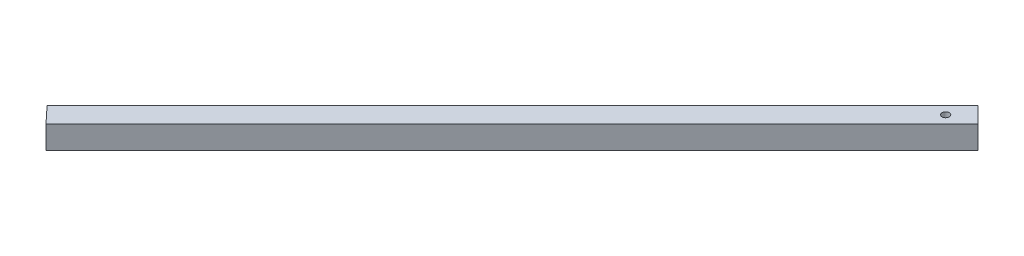
ISO-10303-21;
HEADER;
FILE_DESCRIPTION(('STEP AP214'),'2;1');
FILE_NAME('part.step','',(''),(''),'','','');
FILE_SCHEMA(('AUTOMOTIVE_DESIGN { 1 0 10303 214 1 1 1 1 }'));
ENDSEC;
DATA;
#1=APPLICATION_CONTEXT('core data for automotive mechanical design processes');
#2=APPLICATION_PROTOCOL_DEFINITION('international standard','automotive_design',2000,#1);
#3=PRODUCT_CONTEXT('',#1,'mechanical');
#4=PRODUCT('Part','Part','',(#3));
#5=PRODUCT_RELATED_PRODUCT_CATEGORY('part','',(#4));
#6=PRODUCT_DEFINITION_FORMATION('','',#4);
#7=PRODUCT_DEFINITION_CONTEXT('part definition',#1,'design');
#8=PRODUCT_DEFINITION('design','',#6,#7);
#9=PRODUCT_DEFINITION_SHAPE('','',#8);
#10=(LENGTH_UNIT() NAMED_UNIT(*) SI_UNIT(.MILLI.,.METRE.));
#11=(NAMED_UNIT(*) PLANE_ANGLE_UNIT() SI_UNIT($,.RADIAN.));
#12=(NAMED_UNIT(*) SI_UNIT($,.STERADIAN.) SOLID_ANGLE_UNIT());
#13=UNCERTAINTY_MEASURE_WITH_UNIT(LENGTH_MEASURE(1.E-05),#10,'distance_accuracy_value','');
#14=(GEOMETRIC_REPRESENTATION_CONTEXT(3) GLOBAL_UNCERTAINTY_ASSIGNED_CONTEXT((#13)) GLOBAL_UNIT_ASSIGNED_CONTEXT((#10,
#11,#12)) REPRESENTATION_CONTEXT('',''));
#15=CARTESIAN_POINT('',(0.,0.,0.));
#16=DIRECTION('',(0.,0.,1.));
#17=DIRECTION('',(1.,0.,0.));
#18=AXIS2_PLACEMENT_3D('',#15,#16,#17);
#19=CARTESIAN_POINT('',(0.,-46.,0.));
#20=DIRECTION('',(0.,-1.,0.));
#21=DIRECTION('',(0.,0.,-1.));
#22=AXIS2_PLACEMENT_3D('',#19,#20,#21);
#23=PLANE('',#22);
#24=DIRECTION('',(0.707113336116839,0.,-0.707100226195491));
#25=VECTOR('',#24,1.);
#26=CARTESIAN_POINT('',(-394.524128884085,-46.,408.658714031688));
#27=LINE('',#26,#25);
#28=CARTESIAN_POINT('',(-394.524128884085,-46.,408.658714031688));
#29=VERTEX_POINT('',#28);
#30=CARTESIAN_POINT('',(12.7279220613527,-46.,1.4142135623679));
#31=VERTEX_POINT('',#30);
#32=EDGE_CURVE('E87',#29,#31,#27,.T.);
#33=ORIENTED_EDGE('',*,*,#32,.T.);
#34=DIRECTION('',(-0.707106781186548,0.,-0.707106781186547));
#35=VECTOR('',#34,1.);
#36=CARTESIAN_POINT('',(-1.4142135623783,-46.,-12.727922061363));
#37=LINE('',#36,#35);
#38=CARTESIAN_POINT('',(-1.4142135623783,-46.,-12.727922061363));
#39=VERTEX_POINT('',#38);
#40=EDGE_CURVE('E82',#31,#39,#37,.T.);
#41=ORIENTED_EDGE('',*,*,#40,.T.);
#42=DIRECTION('',(-0.707100218749704,0.,0.707113343562488));
#43=VECTOR('',#42,1.);
#44=CARTESIAN_POINT('',(-1.4142135623783,-46.,-12.727922061363));
#45=LINE('',#44,#43);
#46=CARTESIAN_POINT('',(-408.196650502337,-46.,394.062065354733));
#47=VERTEX_POINT('',#46);
#48=EDGE_CURVE('E85',#39,#47,#45,.T.);
#49=ORIENTED_EDGE('',*,*,#48,.T.);
#50=DIRECTION('',(0.683626080912601,0.,0.729832433847714));
#51=VECTOR('',#50,1.);
#52=CARTESIAN_POINT('',(-408.196650502337,-46.,394.062065354733));
#53=LINE('',#52,#51);
#54=EDGE_CURVE('E52',#47,#29,#53,.T.);
#55=ORIENTED_EDGE('',*,*,#54,.T.);
#56=EDGE_LOOP('',(#33,#41,#49,#55));
#57=FACE_BOUND('',#56,.T.);
#58=CARTESIAN_POINT('',(-8.48528137424377,-46.,8.48528137423338));
#59=DIRECTION('',(0.,1.,0.));
#60=DIRECTION('',(0.,0.,1.));
#61=AXIS2_PLACEMENT_3D('',#58,#59,#60);
#62=CIRCLE('',#61,3.19266946109404);
#63=CARTESIAN_POINT('',(-8.48528137424377,-46.,11.6779508353274));
#64=VERTEX_POINT('',#63);
#65=EDGE_CURVE('E102',#64,#64,#62,.T.);
#66=ORIENTED_EDGE('',*,*,#65,.F.);
#67=EDGE_LOOP('',(#66));
#68=FACE_BOUND('',#67,.T.);
#69=ADVANCED_FACE('F35',(#57,#68),#23,.F.);
#70=CARTESIAN_POINT('',(0.,-66.,0.));
#71=DIRECTION('',(0.,-1.,0.));
#72=DIRECTION('',(0.,0.,-1.));
#73=AXIS2_PLACEMENT_3D('',#70,#71,#72);
#74=PLANE('',#73);
#75=DIRECTION('',(0.707113336116839,0.,-0.707100226195491));
#76=VECTOR('',#75,1.);
#77=CARTESIAN_POINT('',(-394.524128884085,-66.,408.658714031688));
#78=LINE('',#77,#76);
#79=CARTESIAN_POINT('',(-394.524128884085,-66.,408.658714031688));
#80=VERTEX_POINT('',#79);
#81=CARTESIAN_POINT('',(12.7279220613527,-66.,1.4142135623679));
#82=VERTEX_POINT('',#81);
#83=EDGE_CURVE('E99',#80,#82,#78,.T.);
#84=ORIENTED_EDGE('',*,*,#83,.F.);
#85=DIRECTION('',(0.683626080912601,0.,0.729832433847714));
#86=VECTOR('',#85,1.);
#87=CARTESIAN_POINT('',(-408.196650502337,-66.,394.062065354733));
#88=LINE('',#87,#86);
#89=CARTESIAN_POINT('',(-408.196650502337,-66.,394.062065354733));
#90=VERTEX_POINT('',#89);
#91=EDGE_CURVE('E75',#90,#80,#88,.T.);
#92=ORIENTED_EDGE('',*,*,#91,.F.);
#93=DIRECTION('',(-0.707100218749704,0.,0.707113343562488));
#94=VECTOR('',#93,1.);
#95=CARTESIAN_POINT('',(-1.4142135623783,-66.,-12.727922061363));
#96=LINE('',#95,#94);
#97=CARTESIAN_POINT('',(-1.4142135623783,-66.,-12.727922061363));
#98=VERTEX_POINT('',#97);
#99=EDGE_CURVE('E69',#98,#90,#96,.T.);
#100=ORIENTED_EDGE('',*,*,#99,.F.);
#101=DIRECTION('',(-0.707106781186548,0.,-0.707106781186547));
#102=VECTOR('',#101,1.);
#103=CARTESIAN_POINT('',(-1.4142135623783,-66.,-12.727922061363));
#104=LINE('',#103,#102);
#105=EDGE_CURVE('E91',#82,#98,#104,.T.);
#106=ORIENTED_EDGE('',*,*,#105,.F.);
#107=EDGE_LOOP('',(#84,#92,#100,#106));
#108=FACE_BOUND('',#107,.T.);
#109=CARTESIAN_POINT('',(-8.48528137424377,-66.,8.48528137423338));
#110=DIRECTION('',(0.,1.,0.));
#111=DIRECTION('',(0.,0.,1.));
#112=AXIS2_PLACEMENT_3D('',#109,#110,#111);
#113=CIRCLE('',#112,3.19266946109404);
#114=CARTESIAN_POINT('',(-8.48528137424377,-66.,11.6779508353274));
#115=VERTEX_POINT('',#114);
#116=EDGE_CURVE('E114',#115,#115,#113,.T.);
#117=ORIENTED_EDGE('',*,*,#116,.T.);
#118=EDGE_LOOP('',(#117));
#119=FACE_BOUND('',#118,.T.);
#120=ADVANCED_FACE('F110',(#108,#119),#74,.T.);
#121=CARTESIAN_POINT('',(-394.524128884085,-46.,408.658714031688));
#122=DIRECTION('',(-0.707100226195491,0.,-0.707113336116839));
#123=DIRECTION('',(-0.707113336116839,0.,0.707100226195491));
#124=AXIS2_PLACEMENT_3D('',#121,#122,#123);
#125=PLANE('',#124);
#126=ORIENTED_EDGE('',*,*,#83,.T.);
#127=DIRECTION('',(0.,-1.,0.));
#128=VECTOR('',#127,1.);
#129=CARTESIAN_POINT('',(12.7279220613527,-46.,1.4142135623679));
#130=LINE('',#129,#128);
#131=EDGE_CURVE('E11',#31,#82,#130,.T.);
#132=ORIENTED_EDGE('',*,*,#131,.F.);
#133=ORIENTED_EDGE('',*,*,#32,.F.);
#134=DIRECTION('',(0.,-1.,0.));
#135=VECTOR('',#134,1.);
#136=CARTESIAN_POINT('',(-394.524128884085,-46.,408.658714031688));
#137=LINE('',#136,#135);
#138=EDGE_CURVE('E95',#29,#80,#137,.T.);
#139=ORIENTED_EDGE('',*,*,#138,.T.);
#140=EDGE_LOOP('',(#126,#132,#133,#139));
#141=FACE_BOUND('',#140,.T.);
#142=ADVANCED_FACE('F37',(#141),#125,.F.);
#143=CARTESIAN_POINT('',(-1.4142135623783,-46.,-12.727922061363));
#144=DIRECTION('',(-0.707106781186547,0.,0.707106781186548));
#145=DIRECTION('',(0.707106781186548,0.,0.707106781186547));
#146=AXIS2_PLACEMENT_3D('',#143,#144,#145);
#147=PLANE('',#146);
#148=ORIENTED_EDGE('',*,*,#105,.T.);
#149=DIRECTION('',(0.,-1.,0.));
#150=VECTOR('',#149,1.);
#151=CARTESIAN_POINT('',(-1.4142135623783,-46.,-12.727922061363));
#152=LINE('',#151,#150);
#153=EDGE_CURVE('E44',#39,#98,#152,.T.);
#154=ORIENTED_EDGE('',*,*,#153,.F.);
#155=ORIENTED_EDGE('',*,*,#40,.F.);
#156=ORIENTED_EDGE('',*,*,#131,.T.);
#157=EDGE_LOOP('',(#148,#154,#155,#156));
#158=FACE_BOUND('',#157,.T.);
#159=ADVANCED_FACE('F90',(#158),#147,.F.);
#160=CARTESIAN_POINT('',(-1.4142135623783,-46.,-12.727922061363));
#161=DIRECTION('',(0.707113343562488,0.,0.707100218749704));
#162=DIRECTION('',(0.707100218749704,0.,-0.707113343562488));
#163=AXIS2_PLACEMENT_3D('',#160,#161,#162);
#164=PLANE('',#163);
#165=ORIENTED_EDGE('',*,*,#99,.T.);
#166=DIRECTION('',(0.,-1.,0.));
#167=VECTOR('',#166,1.);
#168=CARTESIAN_POINT('',(-408.196650502337,-46.,394.062065354733));
#169=LINE('',#168,#167);
#170=EDGE_CURVE('E92',#47,#90,#169,.T.);
#171=ORIENTED_EDGE('',*,*,#170,.F.);
#172=ORIENTED_EDGE('',*,*,#48,.F.);
#173=ORIENTED_EDGE('',*,*,#153,.T.);
#174=EDGE_LOOP('',(#165,#171,#172,#173));
#175=FACE_BOUND('',#174,.T.);
#176=ADVANCED_FACE('F93',(#175),#164,.F.);
#177=CARTESIAN_POINT('',(-408.196650502337,-46.,394.062065354733));
#178=DIRECTION('',(0.729832433847714,0.,-0.683626080912601));
#179=DIRECTION('',(-0.683626080912601,0.,-0.729832433847714));
#180=AXIS2_PLACEMENT_3D('',#177,#178,#179);
#181=PLANE('',#180);
#182=ORIENTED_EDGE('',*,*,#91,.T.);
#183=ORIENTED_EDGE('',*,*,#138,.F.);
#184=ORIENTED_EDGE('',*,*,#54,.F.);
#185=ORIENTED_EDGE('',*,*,#170,.T.);
#186=EDGE_LOOP('',(#182,#183,#184,#185));
#187=FACE_BOUND('',#186,.T.);
#188=ADVANCED_FACE('F107',(#187),#181,.F.);
#189=CARTESIAN_POINT('',(-8.48528137424377,-46.,8.48528137423338));
#190=DIRECTION('',(0.,-1.,0.));
#191=DIRECTION('',(0.,0.,-1.));
#192=AXIS2_PLACEMENT_3D('',#189,#190,#191);
#193=CYLINDRICAL_SURFACE('',#192,3.19266946109404);
#194=ORIENTED_EDGE('',*,*,#65,.T.);
#195=EDGE_LOOP('',(#194));
#196=FACE_BOUND('',#195,.T.);
#197=ORIENTED_EDGE('',*,*,#116,.F.);
#198=EDGE_LOOP('',(#197));
#199=FACE_BOUND('',#198,.T.);
#200=ADVANCED_FACE('F120',(#196,#199),#193,.F.);
#201=CLOSED_SHELL('',(#69,#120,#142,#159,#176,#188,#200));
#202=MANIFOLD_SOLID_BREP('B2',#201);
#203=ADVANCED_BREP_SHAPE_REPRESENTATION('',(#18,#202),#14);
#204=SHAPE_DEFINITION_REPRESENTATION(#9,#203);
ENDSEC;
END-ISO-10303-21;
